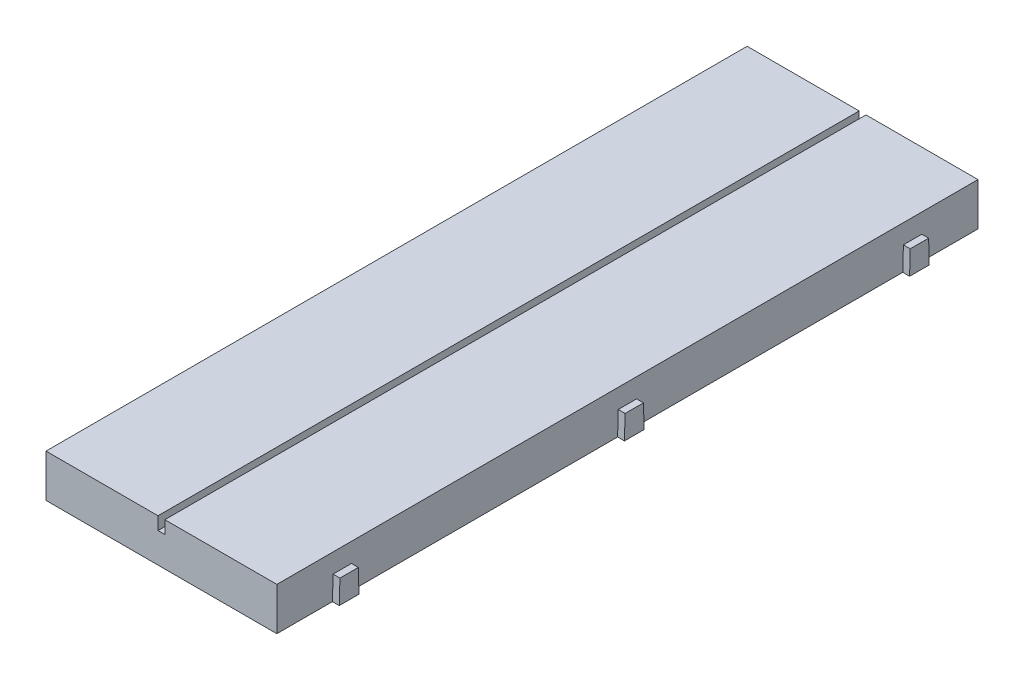
ISO-10303-21;
HEADER;
FILE_DESCRIPTION(('STEP AP214'),'2;1');
FILE_NAME('part.step','',(''),(''),'','','');
FILE_SCHEMA(('AUTOMOTIVE_DESIGN { 1 0 10303 214 1 1 1 1 }'));
ENDSEC;
DATA;
#1=APPLICATION_CONTEXT('core data for automotive mechanical design processes');
#2=APPLICATION_PROTOCOL_DEFINITION('international standard','automotive_design',2000,#1);
#3=PRODUCT_CONTEXT('',#1,'mechanical');
#4=PRODUCT('Part','Part','',(#3));
#5=PRODUCT_RELATED_PRODUCT_CATEGORY('part','',(#4));
#6=PRODUCT_DEFINITION_FORMATION('','',#4);
#7=PRODUCT_DEFINITION_CONTEXT('part definition',#1,'design');
#8=PRODUCT_DEFINITION('design','',#6,#7);
#9=PRODUCT_DEFINITION_SHAPE('','',#8);
#10=(LENGTH_UNIT() NAMED_UNIT(*) SI_UNIT(.MILLI.,.METRE.));
#11=(NAMED_UNIT(*) PLANE_ANGLE_UNIT() SI_UNIT($,.RADIAN.));
#12=(NAMED_UNIT(*) SI_UNIT($,.STERADIAN.) SOLID_ANGLE_UNIT());
#13=UNCERTAINTY_MEASURE_WITH_UNIT(LENGTH_MEASURE(1.E-05),#10,'distance_accuracy_value','');
#14=(GEOMETRIC_REPRESENTATION_CONTEXT(3) GLOBAL_UNCERTAINTY_ASSIGNED_CONTEXT((#13)) GLOBAL_UNIT_ASSIGNED_CONTEXT((#10,
#11,#12)) REPRESENTATION_CONTEXT('',''));
#15=CARTESIAN_POINT('',(0.,0.,0.));
#16=DIRECTION('',(0.,0.,1.));
#17=DIRECTION('',(1.,0.,0.));
#18=AXIS2_PLACEMENT_3D('',#15,#16,#17);
#19=CARTESIAN_POINT('',(27.,9.99999999999999,164.));
#20=DIRECTION('',(-1.,0.,0.));
#21=DIRECTION('',(0.,0.,1.));
#22=AXIS2_PLACEMENT_3D('',#19,#20,#21);
#23=PLANE('',#22);
#24=DIRECTION('',(0.,0.99962830651038,0.0272625901775528));
#25=VECTOR('',#24,1.);
#26=CARTESIAN_POINT('',(27.,5.5,79.85));
#27=LINE('',#26,#25);
#28=CARTESIAN_POINT('',(27.,0.,79.7));
#29=VERTEX_POINT('',#28);
#30=CARTESIAN_POINT('',(27.,5.5,79.85));
#31=VERTEX_POINT('',#30);
#32=EDGE_CURVE('E379',#29,#31,#27,.T.);
#33=ORIENTED_EDGE('',*,*,#32,.F.);
#34=DIRECTION('',(0.,0.,-1.));
#35=VECTOR('',#34,1.);
#36=CARTESIAN_POINT('',(27.,0.,164.));
#37=LINE('',#36,#35);
#38=CARTESIAN_POINT('',(27.,0.,17.6));
#39=VERTEX_POINT('',#38);
#40=EDGE_CURVE('E575',#29,#39,#37,.T.);
#41=ORIENTED_EDGE('',*,*,#40,.T.);
#42=DIRECTION('',(0.,-0.99962830651038,0.0272625901775527));
#43=VECTOR('',#42,1.);
#44=CARTESIAN_POINT('',(27.,5.50000000000002,17.45));
#45=LINE('',#44,#43);
#46=CARTESIAN_POINT('',(27.,5.50000000000002,17.45));
#47=VERTEX_POINT('',#46);
#48=EDGE_CURVE('E426',#47,#39,#45,.T.);
#49=ORIENTED_EDGE('',*,*,#48,.F.);
#50=DIRECTION('',(0.,0.,1.));
#51=VECTOR('',#50,1.);
#52=CARTESIAN_POINT('',(27.,5.50000000000002,13.15));
#53=LINE('',#52,#51);
#54=CARTESIAN_POINT('',(27.,5.50000000000002,13.15));
#55=VERTEX_POINT('',#54);
#56=EDGE_CURVE('E439',#55,#47,#53,.T.);
#57=ORIENTED_EDGE('',*,*,#56,.F.);
#58=DIRECTION('',(0.,0.99962830651038,0.0272625901775527));
#59=VECTOR('',#58,1.);
#60=CARTESIAN_POINT('',(27.,0.,13.));
#61=LINE('',#60,#59);
#62=CARTESIAN_POINT('',(27.,0.,13.));
#63=VERTEX_POINT('',#62);
#64=EDGE_CURVE('E420',#63,#55,#61,.T.);
#65=ORIENTED_EDGE('',*,*,#64,.F.);
#66=CARTESIAN_POINT('',(27.,0.,0.));
#67=VERTEX_POINT('',#66);
#68=EDGE_CURVE('E569',#63,#67,#37,.T.);
#69=ORIENTED_EDGE('',*,*,#68,.T.);
#70=DIRECTION('',(0.,1.,0.));
#71=VECTOR('',#70,1.);
#72=CARTESIAN_POINT('',(27.,9.99999999999999,0.));
#73=LINE('',#72,#71);
#74=CARTESIAN_POINT('',(27.,9.99999999999999,0.));
#75=VERTEX_POINT('',#74);
#76=EDGE_CURVE('E543',#67,#75,#73,.T.);
#77=ORIENTED_EDGE('',*,*,#76,.T.);
#78=DIRECTION('',(0.,0.,-1.));
#79=VECTOR('',#78,1.);
#80=CARTESIAN_POINT('',(27.,9.99999999999999,164.));
#81=LINE('',#80,#79);
#82=CARTESIAN_POINT('',(27.,9.99999999999999,164.));
#83=VERTEX_POINT('',#82);
#84=EDGE_CURVE('E565',#83,#75,#81,.T.);
#85=ORIENTED_EDGE('',*,*,#84,.F.);
#86=DIRECTION('',(0.,1.,0.));
#87=VECTOR('',#86,1.);
#88=CARTESIAN_POINT('',(27.,9.99999999999999,164.));
#89=LINE('',#88,#87);
#90=CARTESIAN_POINT('',(27.,0.,164.));
#91=VERTEX_POINT('',#90);
#92=EDGE_CURVE('E517',#91,#83,#89,.T.);
#93=ORIENTED_EDGE('',*,*,#92,.F.);
#94=CARTESIAN_POINT('',(27.,0.,151.));
#95=VERTEX_POINT('',#94);
#96=EDGE_CURVE('E570',#91,#95,#37,.T.);
#97=ORIENTED_EDGE('',*,*,#96,.T.);
#98=DIRECTION('',(0.,-0.99962830651038,0.0272625901775528));
#99=VECTOR('',#98,1.);
#100=CARTESIAN_POINT('',(27.,0.,151.));
#101=LINE('',#100,#99);
#102=CARTESIAN_POINT('',(27.,5.5,150.85));
#103=VERTEX_POINT('',#102);
#104=EDGE_CURVE('E467',#103,#95,#101,.T.);
#105=ORIENTED_EDGE('',*,*,#104,.F.);
#106=DIRECTION('',(0.,0.,1.));
#107=VECTOR('',#106,1.);
#108=CARTESIAN_POINT('',(27.,5.5,150.85));
#109=LINE('',#108,#107);
#110=CARTESIAN_POINT('',(27.,5.5,146.55));
#111=VERTEX_POINT('',#110);
#112=EDGE_CURVE('E480',#111,#103,#109,.T.);
#113=ORIENTED_EDGE('',*,*,#112,.F.);
#114=DIRECTION('',(0.,0.99962830651038,0.0272625901775528));
#115=VECTOR('',#114,1.);
#116=CARTESIAN_POINT('',(27.,5.5,146.55));
#117=LINE('',#116,#115);
#118=CARTESIAN_POINT('',(27.,0.,146.4));
#119=VERTEX_POINT('',#118);
#120=EDGE_CURVE('E461',#119,#111,#117,.T.);
#121=ORIENTED_EDGE('',*,*,#120,.F.);
#122=CARTESIAN_POINT('',(27.,0.,84.3));
#123=VERTEX_POINT('',#122);
#124=EDGE_CURVE('E574',#119,#123,#37,.T.);
#125=ORIENTED_EDGE('',*,*,#124,.T.);
#126=DIRECTION('',(0.,-0.99962830651038,0.0272625901775528));
#127=VECTOR('',#126,1.);
#128=CARTESIAN_POINT('',(27.,0.,84.3));
#129=LINE('',#128,#127);
#130=CARTESIAN_POINT('',(27.,5.5,84.15));
#131=VERTEX_POINT('',#130);
#132=EDGE_CURVE('E385',#131,#123,#129,.T.);
#133=ORIENTED_EDGE('',*,*,#132,.F.);
#134=DIRECTION('',(0.,0.,1.));
#135=VECTOR('',#134,1.);
#136=CARTESIAN_POINT('',(27.,5.5,84.15));
#137=LINE('',#136,#135);
#138=EDGE_CURVE('E398',#31,#131,#137,.T.);
#139=ORIENTED_EDGE('',*,*,#138,.F.);
#140=EDGE_LOOP('',(#33,#41,#49,#57,#65,#69,#77,#85,#93,#97,#105,#113,#121,#125,#133,#139));
#141=FACE_BOUND('',#140,.T.);
#142=ADVANCED_FACE('F39',(#141),#23,.F.);
#143=CARTESIAN_POINT('',(-0.799999999999999,9.99999999999999,164.));
#144=DIRECTION('',(-1.,0.,0.));
#145=DIRECTION('',(0.,-1.,0.));
#146=AXIS2_PLACEMENT_3D('',#143,#144,#145);
#147=PLANE('',#146);
#148=DIRECTION('',(0.,1.,0.));
#149=VECTOR('',#148,1.);
#150=CARTESIAN_POINT('',(-0.799999999999999,9.99999999999999,0.));
#151=LINE('',#150,#149);
#152=CARTESIAN_POINT('',(-0.8,7.,0.));
#153=VERTEX_POINT('',#152);
#154=CARTESIAN_POINT('',(-0.799999999999999,9.99999999999999,0.));
#155=VERTEX_POINT('',#154);
#156=EDGE_CURVE('E502',#153,#155,#151,.T.);
#157=ORIENTED_EDGE('',*,*,#156,.T.);
#158=DIRECTION('',(0.,0.,-1.));
#159=VECTOR('',#158,1.);
#160=CARTESIAN_POINT('',(-0.799999999999999,9.99999999999999,164.));
#161=LINE('',#160,#159);
#162=CARTESIAN_POINT('',(-0.799999999999999,9.99999999999999,164.));
#163=VERTEX_POINT('',#162);
#164=EDGE_CURVE('E11',#163,#155,#161,.T.);
#165=ORIENTED_EDGE('',*,*,#164,.F.);
#166=DIRECTION('',(0.,1.,0.));
#167=VECTOR('',#166,1.);
#168=CARTESIAN_POINT('',(-0.799999999999999,9.99999999999999,164.));
#169=LINE('',#168,#167);
#170=CARTESIAN_POINT('',(-0.8,7.,164.));
#171=VERTEX_POINT('',#170);
#172=EDGE_CURVE('E503',#171,#163,#169,.T.);
#173=ORIENTED_EDGE('',*,*,#172,.F.);
#174=DIRECTION('',(0.,0.,-1.));
#175=VECTOR('',#174,1.);
#176=CARTESIAN_POINT('',(-0.8,7.,164.));
#177=LINE('',#176,#175);
#178=EDGE_CURVE('E529',#171,#153,#177,.T.);
#179=ORIENTED_EDGE('',*,*,#178,.T.);
#180=EDGE_LOOP('',(#157,#165,#173,#179));
#181=FACE_BOUND('',#180,.T.);
#182=ADVANCED_FACE('F41',(#181),#147,.F.);
#183=CARTESIAN_POINT('',(-27.,9.99999999999999,164.));
#184=DIRECTION('',(0.,-1.,0.));
#185=DIRECTION('',(1.,0.,0.));
#186=AXIS2_PLACEMENT_3D('',#183,#184,#185);
#187=PLANE('',#186);
#188=DIRECTION('',(-1.,0.,0.));
#189=VECTOR('',#188,1.);
#190=CARTESIAN_POINT('',(-27.,9.99999999999999,0.));
#191=LINE('',#190,#189);
#192=CARTESIAN_POINT('',(-27.,9.99999999999999,0.));
#193=VERTEX_POINT('',#192);
#194=EDGE_CURVE('E533',#155,#193,#191,.T.);
#195=ORIENTED_EDGE('',*,*,#194,.T.);
#196=DIRECTION('',(0.,0.,-1.));
#197=VECTOR('',#196,1.);
#198=CARTESIAN_POINT('',(-27.,9.99999999999999,164.));
#199=LINE('',#198,#197);
#200=CARTESIAN_POINT('',(-27.,9.99999999999999,164.));
#201=VERTEX_POINT('',#200);
#202=EDGE_CURVE('E48',#201,#193,#199,.T.);
#203=ORIENTED_EDGE('',*,*,#202,.F.);
#204=DIRECTION('',(-1.,0.,0.));
#205=VECTOR('',#204,1.);
#206=CARTESIAN_POINT('',(-27.,9.99999999999999,164.));
#207=LINE('',#206,#205);
#208=EDGE_CURVE('E507',#163,#201,#207,.T.);
#209=ORIENTED_EDGE('',*,*,#208,.F.);
#210=ORIENTED_EDGE('',*,*,#164,.T.);
#211=EDGE_LOOP('',(#195,#203,#209,#210));
#212=FACE_BOUND('',#211,.T.);
#213=ADVANCED_FACE('F634',(#212),#187,.F.);
#214=CARTESIAN_POINT('',(-27.,9.99999999999999,164.));
#215=DIRECTION('',(1.,0.,0.));
#216=DIRECTION('',(0.,0.,-1.));
#217=AXIS2_PLACEMENT_3D('',#214,#215,#216);
#218=PLANE('',#217);
#219=DIRECTION('',(0.,0.,1.));
#220=VECTOR('',#219,1.);
#221=CARTESIAN_POINT('',(-27.,5.5,84.15));
#222=LINE('',#221,#220);
#223=CARTESIAN_POINT('',(-27.,5.5,79.85));
#224=VERTEX_POINT('',#223);
#225=CARTESIAN_POINT('',(-27.,5.5,84.15));
#226=VERTEX_POINT('',#225);
#227=EDGE_CURVE('E287',#224,#226,#222,.T.);
#228=ORIENTED_EDGE('',*,*,#227,.T.);
#229=DIRECTION('',(0.,-0.99962830651038,0.0272625901775528));
#230=VECTOR('',#229,1.);
#231=CARTESIAN_POINT('',(-27.,0.,84.3));
#232=LINE('',#231,#230);
#233=CARTESIAN_POINT('',(-27.,0.,84.3));
#234=VERTEX_POINT('',#233);
#235=EDGE_CURVE('E284',#226,#234,#232,.T.);
#236=ORIENTED_EDGE('',*,*,#235,.T.);
#237=DIRECTION('',(0.,0.,-1.));
#238=VECTOR('',#237,1.);
#239=CARTESIAN_POINT('',(-27.,0.,164.));
#240=LINE('',#239,#238);
#241=CARTESIAN_POINT('',(-27.,0.,146.4));
#242=VERTEX_POINT('',#241);
#243=EDGE_CURVE('E256',#242,#234,#240,.T.);
#244=ORIENTED_EDGE('',*,*,#243,.F.);
#245=DIRECTION('',(0.,0.99962830651038,0.0272625901775528));
#246=VECTOR('',#245,1.);
#247=CARTESIAN_POINT('',(-27.,5.5,146.55));
#248=LINE('',#247,#246);
#249=CARTESIAN_POINT('',(-27.,5.5,146.55));
#250=VERTEX_POINT('',#249);
#251=EDGE_CURVE('E345',#242,#250,#248,.T.);
#252=ORIENTED_EDGE('',*,*,#251,.T.);
#253=DIRECTION('',(0.,0.,1.));
#254=VECTOR('',#253,1.);
#255=CARTESIAN_POINT('',(-27.,5.5,150.85));
#256=LINE('',#255,#254);
#257=CARTESIAN_POINT('',(-27.,5.5,150.85));
#258=VERTEX_POINT('',#257);
#259=EDGE_CURVE('E361',#250,#258,#256,.T.);
#260=ORIENTED_EDGE('',*,*,#259,.T.);
#261=DIRECTION('',(0.,-0.99962830651038,0.0272625901775528));
#262=VECTOR('',#261,1.);
#263=CARTESIAN_POINT('',(-27.,0.,151.));
#264=LINE('',#263,#262);
#265=CARTESIAN_POINT('',(-27.,0.,151.));
#266=VERTEX_POINT('',#265);
#267=EDGE_CURVE('E339',#258,#266,#264,.T.);
#268=ORIENTED_EDGE('',*,*,#267,.T.);
#269=CARTESIAN_POINT('',(-27.,0.,164.));
#270=VERTEX_POINT('',#269);
#271=EDGE_CURVE('E576',#270,#266,#240,.T.);
#272=ORIENTED_EDGE('',*,*,#271,.F.);
#273=DIRECTION('',(0.,-1.,0.));
#274=VECTOR('',#273,1.);
#275=CARTESIAN_POINT('',(-27.,9.99999999999999,164.));
#276=LINE('',#275,#274);
#277=EDGE_CURVE('E511',#201,#270,#276,.T.);
#278=ORIENTED_EDGE('',*,*,#277,.F.);
#279=ORIENTED_EDGE('',*,*,#202,.T.);
#280=DIRECTION('',(0.,-1.,0.));
#281=VECTOR('',#280,1.);
#282=CARTESIAN_POINT('',(-27.,9.99999999999999,0.));
#283=LINE('',#282,#281);
#284=CARTESIAN_POINT('',(-27.,0.,0.));
#285=VERTEX_POINT('',#284);
#286=EDGE_CURVE('E536',#193,#285,#283,.T.);
#287=ORIENTED_EDGE('',*,*,#286,.T.);
#288=CARTESIAN_POINT('',(-27.,0.,13.));
#289=VERTEX_POINT('',#288);
#290=EDGE_CURVE('E573',#289,#285,#240,.T.);
#291=ORIENTED_EDGE('',*,*,#290,.F.);
#292=DIRECTION('',(0.,0.99962830651038,0.0272625901775527));
#293=VECTOR('',#292,1.);
#294=CARTESIAN_POINT('',(-27.,0.,13.));
#295=LINE('',#294,#293);
#296=CARTESIAN_POINT('',(-27.,5.50000000000002,13.15));
#297=VERTEX_POINT('',#296);
#298=EDGE_CURVE('E63',#289,#297,#295,.T.);
#299=ORIENTED_EDGE('',*,*,#298,.T.);
#300=DIRECTION('',(0.,0.,1.));
#301=VECTOR('',#300,1.);
#302=CARTESIAN_POINT('',(-27.,5.50000000000002,13.15));
#303=LINE('',#302,#301);
#304=CARTESIAN_POINT('',(-27.,5.50000000000002,17.45));
#305=VERTEX_POINT('',#304);
#306=EDGE_CURVE('E305',#297,#305,#303,.T.);
#307=ORIENTED_EDGE('',*,*,#306,.T.);
#308=DIRECTION('',(0.,-0.99962830651038,0.0272625901775527));
#309=VECTOR('',#308,1.);
#310=CARTESIAN_POINT('',(-27.,5.50000000000002,17.45));
#311=LINE('',#310,#309);
#312=CARTESIAN_POINT('',(-27.,0.,17.6));
#313=VERTEX_POINT('',#312);
#314=EDGE_CURVE('E320',#305,#313,#311,.T.);
#315=ORIENTED_EDGE('',*,*,#314,.T.);
#316=CARTESIAN_POINT('',(-27.,0.,79.7));
#317=VERTEX_POINT('',#316);
#318=EDGE_CURVE('E579',#317,#313,#240,.T.);
#319=ORIENTED_EDGE('',*,*,#318,.F.);
#320=DIRECTION('',(0.,0.99962830651038,0.0272625901775528));
#321=VECTOR('',#320,1.);
#322=CARTESIAN_POINT('',(-27.,5.5,79.85));
#323=LINE('',#322,#321);
#324=EDGE_CURVE('E55',#317,#224,#323,.T.);
#325=ORIENTED_EDGE('',*,*,#324,.T.);
#326=EDGE_LOOP('',(#228,#236,#244,#252,#260,#268,#272,#278,#279,#287,#291,#299,#307,#315,#319,#325));
#327=FACE_BOUND('',#326,.T.);
#328=ADVANCED_FACE('F586',(#327),#218,.F.);
#329=CARTESIAN_POINT('',(-27.,0.,164.));
#330=DIRECTION('',(0.,1.,0.));
#331=DIRECTION('',(-1.,0.,0.));
#332=AXIS2_PLACEMENT_3D('',#329,#330,#331);
#333=PLANE('',#332);
#334=DIRECTION('',(1.,0.,0.));
#335=VECTOR('',#334,1.);
#336=CARTESIAN_POINT('',(-27.,0.,0.));
#337=LINE('',#336,#335);
#338=EDGE_CURVE('E540',#285,#67,#337,.T.);
#339=ORIENTED_EDGE('',*,*,#338,.T.);
#340=ORIENTED_EDGE('',*,*,#68,.F.);
#341=DIRECTION('',(-1.,0.,0.));
#342=VECTOR('',#341,1.);
#343=CARTESIAN_POINT('',(28.6,0.,13.));
#344=LINE('',#343,#342);
#345=CARTESIAN_POINT('',(28.6,0.,13.));
#346=VERTEX_POINT('',#345);
#347=EDGE_CURVE('E435',#346,#63,#344,.T.);
#348=ORIENTED_EDGE('',*,*,#347,.F.);
#349=DIRECTION('',(0.,0.,-1.));
#350=VECTOR('',#349,1.);
#351=CARTESIAN_POINT('',(28.6,0.,13.));
#352=LINE('',#351,#350);
#353=CARTESIAN_POINT('',(28.6,0.,17.6));
#354=VERTEX_POINT('',#353);
#355=EDGE_CURVE('E432',#354,#346,#352,.T.);
#356=ORIENTED_EDGE('',*,*,#355,.F.);
#357=DIRECTION('',(-1.,0.,0.));
#358=VECTOR('',#357,1.);
#359=CARTESIAN_POINT('',(28.6,0.,17.6));
#360=LINE('',#359,#358);
#361=EDGE_CURVE('E449',#354,#39,#360,.T.);
#362=ORIENTED_EDGE('',*,*,#361,.T.);
#363=ORIENTED_EDGE('',*,*,#40,.F.);
#364=DIRECTION('',(-1.,0.,0.));
#365=VECTOR('',#364,1.);
#366=CARTESIAN_POINT('',(28.6,0.,79.7));
#367=LINE('',#366,#365);
#368=CARTESIAN_POINT('',(28.6,0.,79.7));
#369=VERTEX_POINT('',#368);
#370=EDGE_CURVE('E416',#369,#29,#367,.T.);
#371=ORIENTED_EDGE('',*,*,#370,.F.);
#372=DIRECTION('',(0.,0.,-1.));
#373=VECTOR('',#372,1.);
#374=CARTESIAN_POINT('',(28.6,0.,79.7));
#375=LINE('',#374,#373);
#376=CARTESIAN_POINT('',(28.6,0.,84.3));
#377=VERTEX_POINT('',#376);
#378=EDGE_CURVE('E380',#377,#369,#375,.T.);
#379=ORIENTED_EDGE('',*,*,#378,.F.);
#380=DIRECTION('',(-1.,0.,0.));
#381=VECTOR('',#380,1.);
#382=CARTESIAN_POINT('',(28.6,0.,84.3));
#383=LINE('',#382,#381);
#384=EDGE_CURVE('E394',#377,#123,#383,.T.);
#385=ORIENTED_EDGE('',*,*,#384,.T.);
#386=ORIENTED_EDGE('',*,*,#124,.F.);
#387=DIRECTION('',(-1.,0.,0.));
#388=VECTOR('',#387,1.);
#389=CARTESIAN_POINT('',(28.6,0.,146.4));
#390=LINE('',#389,#388);
#391=CARTESIAN_POINT('',(28.6,0.,146.4));
#392=VERTEX_POINT('',#391);
#393=EDGE_CURVE('E498',#392,#119,#390,.T.);
#394=ORIENTED_EDGE('',*,*,#393,.F.);
#395=DIRECTION('',(0.,0.,-1.));
#396=VECTOR('',#395,1.);
#397=CARTESIAN_POINT('',(28.6,0.,151.));
#398=LINE('',#397,#396);
#399=CARTESIAN_POINT('',(28.6,0.,151.));
#400=VERTEX_POINT('',#399);
#401=EDGE_CURVE('E462',#400,#392,#398,.T.);
#402=ORIENTED_EDGE('',*,*,#401,.F.);
#403=DIRECTION('',(-1.,0.,0.));
#404=VECTOR('',#403,1.);
#405=CARTESIAN_POINT('',(28.6,0.,151.));
#406=LINE('',#405,#404);
#407=EDGE_CURVE('E476',#400,#95,#406,.T.);
#408=ORIENTED_EDGE('',*,*,#407,.T.);
#409=ORIENTED_EDGE('',*,*,#96,.F.);
#410=DIRECTION('',(1.,0.,0.));
#411=VECTOR('',#410,1.);
#412=CARTESIAN_POINT('',(-27.,0.,164.));
#413=LINE('',#412,#411);
#414=EDGE_CURVE('E514',#270,#91,#413,.T.);
#415=ORIENTED_EDGE('',*,*,#414,.F.);
#416=ORIENTED_EDGE('',*,*,#271,.T.);
#417=DIRECTION('',(1.,0.,0.));
#418=VECTOR('',#417,1.);
#419=CARTESIAN_POINT('',(-28.6,0.,151.));
#420=LINE('',#419,#418);
#421=CARTESIAN_POINT('',(-28.6,0.,151.));
#422=VERTEX_POINT('',#421);
#423=EDGE_CURVE('E376',#422,#266,#420,.T.);
#424=ORIENTED_EDGE('',*,*,#423,.F.);
#425=DIRECTION('',(0.,0.,-1.));
#426=VECTOR('',#425,1.);
#427=CARTESIAN_POINT('',(-28.6,0.,151.));
#428=LINE('',#427,#426);
#429=CARTESIAN_POINT('',(-28.6,0.,146.4));
#430=VERTEX_POINT('',#429);
#431=EDGE_CURVE('E340',#422,#430,#428,.T.);
#432=ORIENTED_EDGE('',*,*,#431,.T.);
#433=DIRECTION('',(1.,0.,0.));
#434=VECTOR('',#433,1.);
#435=CARTESIAN_POINT('',(-28.6,0.,146.4));
#436=LINE('',#435,#434);
#437=EDGE_CURVE('E357',#430,#242,#436,.T.);
#438=ORIENTED_EDGE('',*,*,#437,.T.);
#439=ORIENTED_EDGE('',*,*,#243,.T.);
#440=DIRECTION('',(1.,0.,0.));
#441=VECTOR('',#440,1.);
#442=CARTESIAN_POINT('',(-28.6,0.,84.3));
#443=LINE('',#442,#441);
#444=CARTESIAN_POINT('',(-28.6,0.,84.3));
#445=VERTEX_POINT('',#444);
#446=EDGE_CURVE('E249',#445,#234,#443,.T.);
#447=ORIENTED_EDGE('',*,*,#446,.F.);
#448=DIRECTION('',(0.,0.,-1.));
#449=VECTOR('',#448,1.);
#450=CARTESIAN_POINT('',(-28.6,0.,79.7));
#451=LINE('',#450,#449);
#452=CARTESIAN_POINT('',(-28.6,0.,79.7));
#453=VERTEX_POINT('',#452);
#454=EDGE_CURVE('E253',#445,#453,#451,.T.);
#455=ORIENTED_EDGE('',*,*,#454,.T.);
#456=DIRECTION('',(1.,0.,0.));
#457=VECTOR('',#456,1.);
#458=CARTESIAN_POINT('',(-28.6,0.,79.7));
#459=LINE('',#458,#457);
#460=EDGE_CURVE('E283',#453,#317,#459,.T.);
#461=ORIENTED_EDGE('',*,*,#460,.T.);
#462=ORIENTED_EDGE('',*,*,#318,.T.);
#463=DIRECTION('',(1.,0.,0.));
#464=VECTOR('',#463,1.);
#465=CARTESIAN_POINT('',(-28.6,0.,17.6));
#466=LINE('',#465,#464);
#467=CARTESIAN_POINT('',(-28.6,0.,17.6));
#468=VERTEX_POINT('',#467);
#469=EDGE_CURVE('E332',#468,#313,#466,.T.);
#470=ORIENTED_EDGE('',*,*,#469,.F.);
#471=DIRECTION('',(0.,0.,-1.));
#472=VECTOR('',#471,1.);
#473=CARTESIAN_POINT('',(-28.6,0.,13.));
#474=LINE('',#473,#472);
#475=CARTESIAN_POINT('',(-28.6,0.,13.));
#476=VERTEX_POINT('',#475);
#477=EDGE_CURVE('E304',#468,#476,#474,.T.);
#478=ORIENTED_EDGE('',*,*,#477,.T.);
#479=DIRECTION('',(1.,0.,0.));
#480=VECTOR('',#479,1.);
#481=CARTESIAN_POINT('',(-28.6,0.,13.));
#482=LINE('',#481,#480);
#483=EDGE_CURVE('E336',#476,#289,#482,.T.);
#484=ORIENTED_EDGE('',*,*,#483,.T.);
#485=ORIENTED_EDGE('',*,*,#290,.T.);
#486=EDGE_LOOP('',(#339,#340,#348,#356,#362,#363,#371,#379,#385,#386,#394,#402,#408,#409,#415,
#416,#424,#432,#438,#439,#447,#455,#461,#462,#470,#478,#484,#485));
#487=FACE_BOUND('',#486,.T.);
#488=ADVANCED_FACE('F252',(#487),#333,.F.);
#489=CARTESIAN_POINT('',(0.799999999999999,9.99999999999999,164.));
#490=DIRECTION('',(0.,-1.,0.));
#491=DIRECTION('',(1.,0.,0.));
#492=AXIS2_PLACEMENT_3D('',#489,#490,#491);
#493=PLANE('',#492);
#494=DIRECTION('',(-1.,0.,0.));
#495=VECTOR('',#494,1.);
#496=CARTESIAN_POINT('',(0.799999999999999,9.99999999999999,0.));
#497=LINE('',#496,#495);
#498=CARTESIAN_POINT('',(0.799999999999999,9.99999999999999,0.));
#499=VERTEX_POINT('',#498);
#500=EDGE_CURVE('E546',#75,#499,#497,.T.);
#501=ORIENTED_EDGE('',*,*,#500,.T.);
#502=DIRECTION('',(0.,0.,-1.));
#503=VECTOR('',#502,1.);
#504=CARTESIAN_POINT('',(0.799999999999999,9.99999999999999,164.));
#505=LINE('',#504,#503);
#506=CARTESIAN_POINT('',(0.799999999999999,9.99999999999999,164.));
#507=VERTEX_POINT('',#506);
#508=EDGE_CURVE('E561',#507,#499,#505,.T.);
#509=ORIENTED_EDGE('',*,*,#508,.F.);
#510=DIRECTION('',(-1.,0.,0.));
#511=VECTOR('',#510,1.);
#512=CARTESIAN_POINT('',(0.799999999999999,9.99999999999999,164.));
#513=LINE('',#512,#511);
#514=EDGE_CURVE('E520',#83,#507,#513,.T.);
#515=ORIENTED_EDGE('',*,*,#514,.F.);
#516=ORIENTED_EDGE('',*,*,#84,.T.);
#517=EDGE_LOOP('',(#501,#509,#515,#516));
#518=FACE_BOUND('',#517,.T.);
#519=ADVANCED_FACE('F639',(#518),#493,.F.);
#520=CARTESIAN_POINT('',(0.799999999999999,9.99999999999999,164.));
#521=DIRECTION('',(1.,0.,0.));
#522=DIRECTION('',(0.,1.,0.));
#523=AXIS2_PLACEMENT_3D('',#520,#521,#522);
#524=PLANE('',#523);
#525=DIRECTION('',(0.,-1.,0.));
#526=VECTOR('',#525,1.);
#527=CARTESIAN_POINT('',(0.799999999999999,9.99999999999999,0.));
#528=LINE('',#527,#526);
#529=CARTESIAN_POINT('',(0.8,6.99999999999999,0.));
#530=VERTEX_POINT('',#529);
#531=EDGE_CURVE('E549',#499,#530,#528,.T.);
#532=ORIENTED_EDGE('',*,*,#531,.T.);
#533=DIRECTION('',(0.,0.,-1.));
#534=VECTOR('',#533,1.);
#535=CARTESIAN_POINT('',(0.8,6.99999999999999,164.));
#536=LINE('',#535,#534);
#537=CARTESIAN_POINT('',(0.8,6.99999999999999,164.));
#538=VERTEX_POINT('',#537);
#539=EDGE_CURVE('E557',#538,#530,#536,.T.);
#540=ORIENTED_EDGE('',*,*,#539,.F.);
#541=DIRECTION('',(0.,-1.,0.));
#542=VECTOR('',#541,1.);
#543=CARTESIAN_POINT('',(0.799999999999999,9.99999999999999,164.));
#544=LINE('',#543,#542);
#545=EDGE_CURVE('E523',#507,#538,#544,.T.);
#546=ORIENTED_EDGE('',*,*,#545,.F.);
#547=ORIENTED_EDGE('',*,*,#508,.T.);
#548=EDGE_LOOP('',(#532,#540,#546,#547));
#549=FACE_BOUND('',#548,.T.);
#550=ADVANCED_FACE('F659',(#549),#524,.F.);
#551=CARTESIAN_POINT('',(-0.8,7.,164.));
#552=DIRECTION('',(0.,-1.,0.));
#553=DIRECTION('',(1.,0.,0.));
#554=AXIS2_PLACEMENT_3D('',#551,#552,#553);
#555=PLANE('',#554);
#556=DIRECTION('',(-1.,0.,0.));
#557=VECTOR('',#556,1.);
#558=CARTESIAN_POINT('',(-0.8,7.,0.));
#559=LINE('',#558,#557);
#560=EDGE_CURVE('E508',#530,#153,#559,.T.);
#561=ORIENTED_EDGE('',*,*,#560,.T.);
#562=ORIENTED_EDGE('',*,*,#178,.F.);
#563=DIRECTION('',(-1.,0.,0.));
#564=VECTOR('',#563,1.);
#565=CARTESIAN_POINT('',(-0.8,7.,164.));
#566=LINE('',#565,#564);
#567=EDGE_CURVE('E526',#538,#171,#566,.T.);
#568=ORIENTED_EDGE('',*,*,#567,.F.);
#569=ORIENTED_EDGE('',*,*,#539,.T.);
#570=EDGE_LOOP('',(#561,#562,#568,#569));
#571=FACE_BOUND('',#570,.T.);
#572=ADVANCED_FACE('F654',(#571),#555,.F.);
#573=CARTESIAN_POINT('',(0.,0.,164.));
#574=DIRECTION('',(0.,0.,1.));
#575=DIRECTION('',(1.,0.,0.));
#576=AXIS2_PLACEMENT_3D('',#573,#574,#575);
#577=PLANE('',#576);
#578=ORIENTED_EDGE('',*,*,#172,.T.);
#579=ORIENTED_EDGE('',*,*,#208,.T.);
#580=ORIENTED_EDGE('',*,*,#277,.T.);
#581=ORIENTED_EDGE('',*,*,#414,.T.);
#582=ORIENTED_EDGE('',*,*,#92,.T.);
#583=ORIENTED_EDGE('',*,*,#514,.T.);
#584=ORIENTED_EDGE('',*,*,#545,.T.);
#585=ORIENTED_EDGE('',*,*,#567,.T.);
#586=EDGE_LOOP('',(#578,#579,#580,#581,#582,#583,#584,#585));
#587=FACE_BOUND('',#586,.T.);
#588=ADVANCED_FACE('F725',(#587),#577,.T.);
#589=CARTESIAN_POINT('',(0.,0.,0.));
#590=DIRECTION('',(0.,0.,1.));
#591=DIRECTION('',(1.,0.,0.));
#592=AXIS2_PLACEMENT_3D('',#589,#590,#591);
#593=PLANE('',#592);
#594=ORIENTED_EDGE('',*,*,#156,.F.);
#595=ORIENTED_EDGE('',*,*,#560,.F.);
#596=ORIENTED_EDGE('',*,*,#531,.F.);
#597=ORIENTED_EDGE('',*,*,#500,.F.);
#598=ORIENTED_EDGE('',*,*,#76,.F.);
#599=ORIENTED_EDGE('',*,*,#338,.F.);
#600=ORIENTED_EDGE('',*,*,#286,.F.);
#601=ORIENTED_EDGE('',*,*,#194,.F.);
#602=EDGE_LOOP('',(#594,#595,#596,#597,#598,#599,#600,#601));
#603=FACE_BOUND('',#602,.T.);
#604=ADVANCED_FACE('F593',(#603),#593,.F.);
#605=CARTESIAN_POINT('',(28.6,5.5,146.55));
#606=DIRECTION('',(0.,-0.0272625901775528,0.99962830651038));
#607=DIRECTION('',(0.,-0.99962830651038,-0.0272625901775528));
#608=AXIS2_PLACEMENT_3D('',#605,#606,#607);
#609=PLANE('',#608);
#610=ORIENTED_EDGE('',*,*,#120,.T.);
#611=DIRECTION('',(-1.,0.,0.));
#612=VECTOR('',#611,1.);
#613=CARTESIAN_POINT('',(28.6,5.5,146.55));
#614=LINE('',#613,#612);
#615=CARTESIAN_POINT('',(28.6,5.5,146.55));
#616=VERTEX_POINT('',#615);
#617=EDGE_CURVE('E494',#616,#111,#614,.T.);
#618=ORIENTED_EDGE('',*,*,#617,.F.);
#619=DIRECTION('',(0.,0.99962830651038,0.0272625901775528));
#620=VECTOR('',#619,1.);
#621=CARTESIAN_POINT('',(28.6,5.5,146.55));
#622=LINE('',#621,#620);
#623=EDGE_CURVE('E466',#392,#616,#622,.T.);
#624=ORIENTED_EDGE('',*,*,#623,.F.);
#625=ORIENTED_EDGE('',*,*,#393,.T.);
#626=EDGE_LOOP('',(#610,#618,#624,#625));
#627=FACE_BOUND('',#626,.T.);
#628=ADVANCED_FACE('F720',(#627),#609,.F.);
#629=CARTESIAN_POINT('',(28.6,5.5,150.85));
#630=DIRECTION('',(0.,-1.,0.));
#631=DIRECTION('',(0.,0.,-1.));
#632=AXIS2_PLACEMENT_3D('',#629,#630,#631);
#633=PLANE('',#632);
#634=ORIENTED_EDGE('',*,*,#112,.T.);
#635=DIRECTION('',(-1.,0.,0.));
#636=VECTOR('',#635,1.);
#637=CARTESIAN_POINT('',(28.6,5.5,150.85));
#638=LINE('',#637,#636);
#639=CARTESIAN_POINT('',(28.6,5.5,150.85));
#640=VERTEX_POINT('',#639);
#641=EDGE_CURVE('E490',#640,#103,#638,.T.);
#642=ORIENTED_EDGE('',*,*,#641,.F.);
#643=DIRECTION('',(0.,0.,1.));
#644=VECTOR('',#643,1.);
#645=CARTESIAN_POINT('',(28.6,5.5,150.85));
#646=LINE('',#645,#644);
#647=EDGE_CURVE('E470',#616,#640,#646,.T.);
#648=ORIENTED_EDGE('',*,*,#647,.F.);
#649=ORIENTED_EDGE('',*,*,#617,.T.);
#650=EDGE_LOOP('',(#634,#642,#648,#649));
#651=FACE_BOUND('',#650,.T.);
#652=ADVANCED_FACE('F716',(#651),#633,.F.);
#653=CARTESIAN_POINT('',(28.6,0.,151.));
#654=DIRECTION('',(0.,-0.0272625901775528,-0.99962830651038));
#655=DIRECTION('',(0.,0.99962830651038,-0.0272625901775528));
#656=AXIS2_PLACEMENT_3D('',#653,#654,#655);
#657=PLANE('',#656);
#658=ORIENTED_EDGE('',*,*,#104,.T.);
#659=ORIENTED_EDGE('',*,*,#407,.F.);
#660=DIRECTION('',(0.,-0.99962830651038,0.0272625901775528));
#661=VECTOR('',#660,1.);
#662=CARTESIAN_POINT('',(28.6,0.,151.));
#663=LINE('',#662,#661);
#664=EDGE_CURVE('E473',#640,#400,#663,.T.);
#665=ORIENTED_EDGE('',*,*,#664,.F.);
#666=ORIENTED_EDGE('',*,*,#641,.T.);
#667=EDGE_LOOP('',(#658,#659,#665,#666));
#668=FACE_BOUND('',#667,.T.);
#669=ADVANCED_FACE('F712',(#668),#657,.F.);
#670=CARTESIAN_POINT('',(28.6,0.,0.));
#671=DIRECTION('',(-1.,0.,0.));
#672=DIRECTION('',(0.,0.,1.));
#673=AXIS2_PLACEMENT_3D('',#670,#671,#672);
#674=PLANE('',#673);
#675=ORIENTED_EDGE('',*,*,#401,.T.);
#676=ORIENTED_EDGE('',*,*,#623,.T.);
#677=ORIENTED_EDGE('',*,*,#647,.T.);
#678=ORIENTED_EDGE('',*,*,#664,.T.);
#679=EDGE_LOOP('',(#675,#676,#677,#678));
#680=FACE_BOUND('',#679,.T.);
#681=ADVANCED_FACE('F708',(#680),#674,.F.);
#682=CARTESIAN_POINT('',(28.6,0.,13.));
#683=DIRECTION('',(0.,-0.0272625901775527,0.99962830651038));
#684=DIRECTION('',(0.,-0.99962830651038,-0.0272625901775527));
#685=AXIS2_PLACEMENT_3D('',#682,#683,#684);
#686=PLANE('',#685);
#687=ORIENTED_EDGE('',*,*,#64,.T.);
#688=DIRECTION('',(-1.,0.,0.));
#689=VECTOR('',#688,1.);
#690=CARTESIAN_POINT('',(28.6,5.50000000000002,13.15));
#691=LINE('',#690,#689);
#692=CARTESIAN_POINT('',(28.6,5.50000000000002,13.15));
#693=VERTEX_POINT('',#692);
#694=EDGE_CURVE('E457',#693,#55,#691,.T.);
#695=ORIENTED_EDGE('',*,*,#694,.F.);
#696=DIRECTION('',(0.,0.99962830651038,0.0272625901775527));
#697=VECTOR('',#696,1.);
#698=CARTESIAN_POINT('',(28.6,0.,13.));
#699=LINE('',#698,#697);
#700=EDGE_CURVE('E421',#346,#693,#699,.T.);
#701=ORIENTED_EDGE('',*,*,#700,.F.);
#702=ORIENTED_EDGE('',*,*,#347,.T.);
#703=EDGE_LOOP('',(#687,#695,#701,#702));
#704=FACE_BOUND('',#703,.T.);
#705=ADVANCED_FACE('F704',(#704),#686,.F.);
#706=CARTESIAN_POINT('',(28.6,5.50000000000002,13.15));
#707=DIRECTION('',(0.,-1.,0.));
#708=DIRECTION('',(0.,0.,-1.));
#709=AXIS2_PLACEMENT_3D('',#706,#707,#708);
#710=PLANE('',#709);
#711=ORIENTED_EDGE('',*,*,#56,.T.);
#712=DIRECTION('',(-1.,0.,0.));
#713=VECTOR('',#712,1.);
#714=CARTESIAN_POINT('',(28.6,5.50000000000002,17.45));
#715=LINE('',#714,#713);
#716=CARTESIAN_POINT('',(28.6,5.50000000000002,17.45));
#717=VERTEX_POINT('',#716);
#718=EDGE_CURVE('E453',#717,#47,#715,.T.);
#719=ORIENTED_EDGE('',*,*,#718,.F.);
#720=DIRECTION('',(0.,0.,1.));
#721=VECTOR('',#720,1.);
#722=CARTESIAN_POINT('',(28.6,5.50000000000002,13.15));
#723=LINE('',#722,#721);
#724=EDGE_CURVE('E425',#693,#717,#723,.T.);
#725=ORIENTED_EDGE('',*,*,#724,.F.);
#726=ORIENTED_EDGE('',*,*,#694,.T.);
#727=EDGE_LOOP('',(#711,#719,#725,#726));
#728=FACE_BOUND('',#727,.T.);
#729=ADVANCED_FACE('F700',(#728),#710,.F.);
#730=CARTESIAN_POINT('',(28.6,5.50000000000002,17.45));
#731=DIRECTION('',(0.,-0.0272625901775527,-0.99962830651038));
#732=DIRECTION('',(0.,0.99962830651038,-0.0272625901775527));
#733=AXIS2_PLACEMENT_3D('',#730,#731,#732);
#734=PLANE('',#733);
#735=ORIENTED_EDGE('',*,*,#48,.T.);
#736=ORIENTED_EDGE('',*,*,#361,.F.);
#737=DIRECTION('',(0.,-0.99962830651038,0.0272625901775527));
#738=VECTOR('',#737,1.);
#739=CARTESIAN_POINT('',(28.6,5.50000000000002,17.45));
#740=LINE('',#739,#738);
#741=EDGE_CURVE('E429',#717,#354,#740,.T.);
#742=ORIENTED_EDGE('',*,*,#741,.F.);
#743=ORIENTED_EDGE('',*,*,#718,.T.);
#744=EDGE_LOOP('',(#735,#736,#742,#743));
#745=FACE_BOUND('',#744,.T.);
#746=ADVANCED_FACE('F693',(#745),#734,.F.);
#747=CARTESIAN_POINT('',(28.6,0.,0.));
#748=DIRECTION('',(1.,0.,0.));
#749=DIRECTION('',(0.,0.,-1.));
#750=AXIS2_PLACEMENT_3D('',#747,#748,#749);
#751=PLANE('',#750);
#752=ORIENTED_EDGE('',*,*,#700,.T.);
#753=ORIENTED_EDGE('',*,*,#724,.T.);
#754=ORIENTED_EDGE('',*,*,#741,.T.);
#755=ORIENTED_EDGE('',*,*,#355,.T.);
#756=EDGE_LOOP('',(#752,#753,#754,#755));
#757=FACE_BOUND('',#756,.T.);
#758=ADVANCED_FACE('F686',(#757),#751,.T.);
#759=CARTESIAN_POINT('',(28.6,5.5,79.85));
#760=DIRECTION('',(0.,-0.0272625901775528,0.99962830651038));
#761=DIRECTION('',(0.,-0.99962830651038,-0.0272625901775528));
#762=AXIS2_PLACEMENT_3D('',#759,#760,#761);
#763=PLANE('',#762);
#764=ORIENTED_EDGE('',*,*,#32,.T.);
#765=DIRECTION('',(-1.,0.,0.));
#766=VECTOR('',#765,1.);
#767=CARTESIAN_POINT('',(28.6,5.5,79.85));
#768=LINE('',#767,#766);
#769=CARTESIAN_POINT('',(28.6,5.5,79.85));
#770=VERTEX_POINT('',#769);
#771=EDGE_CURVE('E412',#770,#31,#768,.T.);
#772=ORIENTED_EDGE('',*,*,#771,.F.);
#773=DIRECTION('',(0.,0.99962830651038,0.0272625901775528));
#774=VECTOR('',#773,1.);
#775=CARTESIAN_POINT('',(28.6,5.5,79.85));
#776=LINE('',#775,#774);
#777=EDGE_CURVE('E384',#369,#770,#776,.T.);
#778=ORIENTED_EDGE('',*,*,#777,.F.);
#779=ORIENTED_EDGE('',*,*,#370,.T.);
#780=EDGE_LOOP('',(#764,#772,#778,#779));
#781=FACE_BOUND('',#780,.T.);
#782=ADVANCED_FACE('F684',(#781),#763,.F.);
#783=CARTESIAN_POINT('',(28.6,5.5,84.15));
#784=DIRECTION('',(0.,-1.,0.));
#785=DIRECTION('',(0.,0.,-1.));
#786=AXIS2_PLACEMENT_3D('',#783,#784,#785);
#787=PLANE('',#786);
#788=ORIENTED_EDGE('',*,*,#138,.T.);
#789=DIRECTION('',(-1.,0.,0.));
#790=VECTOR('',#789,1.);
#791=CARTESIAN_POINT('',(28.6,5.5,84.15));
#792=LINE('',#791,#790);
#793=CARTESIAN_POINT('',(28.6,5.5,84.15));
#794=VERTEX_POINT('',#793);
#795=EDGE_CURVE('E408',#794,#131,#792,.T.);
#796=ORIENTED_EDGE('',*,*,#795,.F.);
#797=DIRECTION('',(0.,0.,1.));
#798=VECTOR('',#797,1.);
#799=CARTESIAN_POINT('',(28.6,5.5,84.15));
#800=LINE('',#799,#798);
#801=EDGE_CURVE('E388',#770,#794,#800,.T.);
#802=ORIENTED_EDGE('',*,*,#801,.F.);
#803=ORIENTED_EDGE('',*,*,#771,.T.);
#804=EDGE_LOOP('',(#788,#796,#802,#803));
#805=FACE_BOUND('',#804,.T.);
#806=ADVANCED_FACE('F682',(#805),#787,.F.);
#807=CARTESIAN_POINT('',(28.6,0.,84.3));
#808=DIRECTION('',(0.,-0.0272625901775528,-0.99962830651038));
#809=DIRECTION('',(0.,0.99962830651038,-0.0272625901775528));
#810=AXIS2_PLACEMENT_3D('',#807,#808,#809);
#811=PLANE('',#810);
#812=ORIENTED_EDGE('',*,*,#132,.T.);
#813=ORIENTED_EDGE('',*,*,#384,.F.);
#814=DIRECTION('',(0.,-0.99962830651038,0.0272625901775528));
#815=VECTOR('',#814,1.);
#816=CARTESIAN_POINT('',(28.6,0.,84.3));
#817=LINE('',#816,#815);
#818=EDGE_CURVE('E391',#794,#377,#817,.T.);
#819=ORIENTED_EDGE('',*,*,#818,.F.);
#820=ORIENTED_EDGE('',*,*,#795,.T.);
#821=EDGE_LOOP('',(#812,#813,#819,#820));
#822=FACE_BOUND('',#821,.T.);
#823=ADVANCED_FACE('F672',(#822),#811,.F.);
#824=CARTESIAN_POINT('',(28.6,0.,0.));
#825=DIRECTION('',(-1.,0.,0.));
#826=DIRECTION('',(0.,0.,1.));
#827=AXIS2_PLACEMENT_3D('',#824,#825,#826);
#828=PLANE('',#827);
#829=ORIENTED_EDGE('',*,*,#378,.T.);
#830=ORIENTED_EDGE('',*,*,#777,.T.);
#831=ORIENTED_EDGE('',*,*,#801,.T.);
#832=ORIENTED_EDGE('',*,*,#818,.T.);
#833=EDGE_LOOP('',(#829,#830,#831,#832));
#834=FACE_BOUND('',#833,.T.);
#835=ADVANCED_FACE('F678',(#834),#828,.F.);
#836=CARTESIAN_POINT('',(-28.6,0.,151.));
#837=DIRECTION('',(0.,0.0272625901775528,0.99962830651038));
#838=DIRECTION('',(0.,-0.99962830651038,0.0272625901775528));
#839=AXIS2_PLACEMENT_3D('',#836,#837,#838);
#840=PLANE('',#839);
#841=ORIENTED_EDGE('',*,*,#267,.F.);
#842=DIRECTION('',(1.,0.,0.));
#843=VECTOR('',#842,1.);
#844=CARTESIAN_POINT('',(-28.6,5.5,150.85));
#845=LINE('',#844,#843);
#846=CARTESIAN_POINT('',(-28.6,5.5,150.85));
#847=VERTEX_POINT('',#846);
#848=EDGE_CURVE('E373',#847,#258,#845,.T.);
#849=ORIENTED_EDGE('',*,*,#848,.F.);
#850=DIRECTION('',(0.,-0.99962830651038,0.0272625901775528));
#851=VECTOR('',#850,1.);
#852=CARTESIAN_POINT('',(-28.6,0.,151.));
#853=LINE('',#852,#851);
#854=EDGE_CURVE('E344',#847,#422,#853,.T.);
#855=ORIENTED_EDGE('',*,*,#854,.T.);
#856=ORIENTED_EDGE('',*,*,#423,.T.);
#857=EDGE_LOOP('',(#841,#849,#855,#856));
#858=FACE_BOUND('',#857,.T.);
#859=ADVANCED_FACE('F762',(#858),#840,.T.);
#860=CARTESIAN_POINT('',(-28.6,5.5,150.85));
#861=DIRECTION('',(0.,1.,0.));
#862=DIRECTION('',(0.,0.,1.));
#863=AXIS2_PLACEMENT_3D('',#860,#861,#862);
#864=PLANE('',#863);
#865=ORIENTED_EDGE('',*,*,#259,.F.);
#866=DIRECTION('',(1.,0.,0.));
#867=VECTOR('',#866,1.);
#868=CARTESIAN_POINT('',(-28.6,5.5,146.55));
#869=LINE('',#868,#867);
#870=CARTESIAN_POINT('',(-28.6,5.5,146.55));
#871=VERTEX_POINT('',#870);
#872=EDGE_CURVE('E370',#871,#250,#869,.T.);
#873=ORIENTED_EDGE('',*,*,#872,.F.);
#874=DIRECTION('',(0.,0.,1.));
#875=VECTOR('',#874,1.);
#876=CARTESIAN_POINT('',(-28.6,5.5,150.85));
#877=LINE('',#876,#875);
#878=EDGE_CURVE('E349',#871,#847,#877,.T.);
#879=ORIENTED_EDGE('',*,*,#878,.T.);
#880=ORIENTED_EDGE('',*,*,#848,.T.);
#881=EDGE_LOOP('',(#865,#873,#879,#880));
#882=FACE_BOUND('',#881,.T.);
#883=ADVANCED_FACE('F766',(#882),#864,.T.);
#884=CARTESIAN_POINT('',(-28.6,5.5,146.55));
#885=DIRECTION('',(0.,0.0272625901775528,-0.99962830651038));
#886=DIRECTION('',(0.,0.99962830651038,0.0272625901775528));
#887=AXIS2_PLACEMENT_3D('',#884,#885,#886);
#888=PLANE('',#887);
#889=ORIENTED_EDGE('',*,*,#251,.F.);
#890=ORIENTED_EDGE('',*,*,#437,.F.);
#891=DIRECTION('',(0.,0.99962830651038,0.0272625901775528));
#892=VECTOR('',#891,1.);
#893=CARTESIAN_POINT('',(-28.6,5.5,146.55));
#894=LINE('',#893,#892);
#895=EDGE_CURVE('E353',#430,#871,#894,.T.);
#896=ORIENTED_EDGE('',*,*,#895,.T.);
#897=ORIENTED_EDGE('',*,*,#872,.T.);
#898=EDGE_LOOP('',(#889,#890,#896,#897));
#899=FACE_BOUND('',#898,.T.);
#900=ADVANCED_FACE('F623',(#899),#888,.T.);
#901=CARTESIAN_POINT('',(-28.6,0.,0.));
#902=DIRECTION('',(1.,0.,0.));
#903=DIRECTION('',(0.,0.,1.));
#904=AXIS2_PLACEMENT_3D('',#901,#902,#903);
#905=PLANE('',#904);
#906=ORIENTED_EDGE('',*,*,#431,.F.);
#907=ORIENTED_EDGE('',*,*,#854,.F.);
#908=ORIENTED_EDGE('',*,*,#878,.F.);
#909=ORIENTED_EDGE('',*,*,#895,.F.);
#910=EDGE_LOOP('',(#906,#907,#908,#909));
#911=FACE_BOUND('',#910,.T.);
#912=ADVANCED_FACE('F616',(#911),#905,.F.);
#913=CARTESIAN_POINT('',(-28.6,0.,13.));
#914=DIRECTION('',(0.,0.0272625901775527,-0.99962830651038));
#915=DIRECTION('',(0.,0.99962830651038,0.0272625901775527));
#916=AXIS2_PLACEMENT_3D('',#913,#914,#915);
#917=PLANE('',#916);
#918=ORIENTED_EDGE('',*,*,#298,.F.);
#919=ORIENTED_EDGE('',*,*,#483,.F.);
#920=DIRECTION('',(0.,0.99962830651038,0.0272625901775527));
#921=VECTOR('',#920,1.);
#922=CARTESIAN_POINT('',(-28.6,0.,13.));
#923=LINE('',#922,#921);
#924=CARTESIAN_POINT('',(-28.6,5.50000000000002,13.15));
#925=VERTEX_POINT('',#924);
#926=EDGE_CURVE('E300',#476,#925,#923,.T.);
#927=ORIENTED_EDGE('',*,*,#926,.T.);
#928=DIRECTION('',(1.,0.,0.));
#929=VECTOR('',#928,1.);
#930=CARTESIAN_POINT('',(-28.6,5.50000000000002,13.15));
#931=LINE('',#930,#929);
#932=EDGE_CURVE('E317',#925,#297,#931,.T.);
#933=ORIENTED_EDGE('',*,*,#932,.T.);
#934=EDGE_LOOP('',(#918,#919,#927,#933));
#935=FACE_BOUND('',#934,.T.);
#936=ADVANCED_FACE('F614',(#935),#917,.T.);
#937=CARTESIAN_POINT('',(-28.6,5.50000000000002,17.45));
#938=DIRECTION('',(0.,0.0272625901775527,0.99962830651038));
#939=DIRECTION('',(0.,-0.99962830651038,0.0272625901775527));
#940=AXIS2_PLACEMENT_3D('',#937,#938,#939);
#941=PLANE('',#940);
#942=ORIENTED_EDGE('',*,*,#314,.F.);
#943=DIRECTION('',(1.,0.,0.));
#944=VECTOR('',#943,1.);
#945=CARTESIAN_POINT('',(-28.6,5.50000000000002,17.45));
#946=LINE('',#945,#944);
#947=CARTESIAN_POINT('',(-28.6,5.50000000000002,17.45));
#948=VERTEX_POINT('',#947);
#949=EDGE_CURVE('E329',#948,#305,#946,.T.);
#950=ORIENTED_EDGE('',*,*,#949,.F.);
#951=DIRECTION('',(0.,-0.99962830651038,0.0272625901775527));
#952=VECTOR('',#951,1.);
#953=CARTESIAN_POINT('',(-28.6,5.50000000000002,17.45));
#954=LINE('',#953,#952);
#955=EDGE_CURVE('E309',#948,#468,#954,.T.);
#956=ORIENTED_EDGE('',*,*,#955,.T.);
#957=ORIENTED_EDGE('',*,*,#469,.T.);
#958=EDGE_LOOP('',(#942,#950,#956,#957));
#959=FACE_BOUND('',#958,.T.);
#960=ADVANCED_FACE('F605',(#959),#941,.T.);
#961=CARTESIAN_POINT('',(-28.6,5.50000000000002,13.15));
#962=DIRECTION('',(0.,1.,0.));
#963=DIRECTION('',(0.,0.,1.));
#964=AXIS2_PLACEMENT_3D('',#961,#962,#963);
#965=PLANE('',#964);
#966=ORIENTED_EDGE('',*,*,#306,.F.);
#967=ORIENTED_EDGE('',*,*,#932,.F.);
#968=DIRECTION('',(0.,0.,1.));
#969=VECTOR('',#968,1.);
#970=CARTESIAN_POINT('',(-28.6,5.50000000000002,13.15));
#971=LINE('',#970,#969);
#972=EDGE_CURVE('E313',#925,#948,#971,.T.);
#973=ORIENTED_EDGE('',*,*,#972,.T.);
#974=ORIENTED_EDGE('',*,*,#949,.T.);
#975=EDGE_LOOP('',(#966,#967,#973,#974));
#976=FACE_BOUND('',#975,.T.);
#977=ADVANCED_FACE('F609',(#976),#965,.T.);
#978=CARTESIAN_POINT('',(-28.6,0.,0.));
#979=DIRECTION('',(-1.,0.,0.));
#980=DIRECTION('',(0.,0.,-1.));
#981=AXIS2_PLACEMENT_3D('',#978,#979,#980);
#982=PLANE('',#981);
#983=ORIENTED_EDGE('',*,*,#926,.F.);
#984=ORIENTED_EDGE('',*,*,#477,.F.);
#985=ORIENTED_EDGE('',*,*,#955,.F.);
#986=ORIENTED_EDGE('',*,*,#972,.F.);
#987=EDGE_LOOP('',(#983,#984,#985,#986));
#988=FACE_BOUND('',#987,.T.);
#989=ADVANCED_FACE('F613',(#988),#982,.T.);
#990=CARTESIAN_POINT('',(-28.6,0.,84.3));
#991=DIRECTION('',(0.,0.0272625901775528,0.99962830651038));
#992=DIRECTION('',(0.,-0.99962830651038,0.0272625901775528));
#993=AXIS2_PLACEMENT_3D('',#990,#991,#992);
#994=PLANE('',#993);
#995=ORIENTED_EDGE('',*,*,#235,.F.);
#996=DIRECTION('',(1.,0.,0.));
#997=VECTOR('',#996,1.);
#998=CARTESIAN_POINT('',(-28.6,5.5,84.15));
#999=LINE('',#998,#997);
#1000=CARTESIAN_POINT('',(-28.6,5.5,84.15));
#1001=VERTEX_POINT('',#1000);
#1002=EDGE_CURVE('E262',#1001,#226,#999,.T.);
#1003=ORIENTED_EDGE('',*,*,#1002,.F.);
#1004=DIRECTION('',(0.,-0.99962830651038,0.0272625901775528));
#1005=VECTOR('',#1004,1.);
#1006=CARTESIAN_POINT('',(-28.6,0.,84.3));
#1007=LINE('',#1006,#1005);
#1008=EDGE_CURVE('E268',#1001,#445,#1007,.T.);
#1009=ORIENTED_EDGE('',*,*,#1008,.T.);
#1010=ORIENTED_EDGE('',*,*,#446,.T.);
#1011=EDGE_LOOP('',(#995,#1003,#1009,#1010));
#1012=FACE_BOUND('',#1011,.T.);
#1013=ADVANCED_FACE('F274',(#1012),#994,.T.);
#1014=CARTESIAN_POINT('',(-28.6,5.5,84.15));
#1015=DIRECTION('',(0.,1.,0.));
#1016=DIRECTION('',(0.,0.,1.));
#1017=AXIS2_PLACEMENT_3D('',#1014,#1015,#1016);
#1018=PLANE('',#1017);
#1019=ORIENTED_EDGE('',*,*,#227,.F.);
#1020=DIRECTION('',(1.,0.,0.));
#1021=VECTOR('',#1020,1.);
#1022=CARTESIAN_POINT('',(-28.6,5.5,79.85));
#1023=LINE('',#1022,#1021);
#1024=CARTESIAN_POINT('',(-28.6,5.5,79.85));
#1025=VERTEX_POINT('',#1024);
#1026=EDGE_CURVE('E295',#1025,#224,#1023,.T.);
#1027=ORIENTED_EDGE('',*,*,#1026,.F.);
#1028=DIRECTION('',(0.,0.,1.));
#1029=VECTOR('',#1028,1.);
#1030=CARTESIAN_POINT('',(-28.6,5.5,84.15));
#1031=LINE('',#1030,#1029);
#1032=EDGE_CURVE('E276',#1025,#1001,#1031,.T.);
#1033=ORIENTED_EDGE('',*,*,#1032,.T.);
#1034=ORIENTED_EDGE('',*,*,#1002,.T.);
#1035=EDGE_LOOP('',(#1019,#1027,#1033,#1034));
#1036=FACE_BOUND('',#1035,.T.);
#1037=ADVANCED_FACE('F826',(#1036),#1018,.T.);
#1038=CARTESIAN_POINT('',(-28.6,5.5,79.85));
#1039=DIRECTION('',(0.,0.0272625901775528,-0.99962830651038));
#1040=DIRECTION('',(0.,0.99962830651038,0.0272625901775528));
#1041=AXIS2_PLACEMENT_3D('',#1038,#1039,#1040);
#1042=PLANE('',#1041);
#1043=ORIENTED_EDGE('',*,*,#324,.F.);
#1044=ORIENTED_EDGE('',*,*,#460,.F.);
#1045=DIRECTION('',(0.,0.99962830651038,0.0272625901775528));
#1046=VECTOR('',#1045,1.);
#1047=CARTESIAN_POINT('',(-28.6,5.5,79.85));
#1048=LINE('',#1047,#1046);
#1049=EDGE_CURVE('E271',#453,#1025,#1048,.T.);
#1050=ORIENTED_EDGE('',*,*,#1049,.T.);
#1051=ORIENTED_EDGE('',*,*,#1026,.T.);
#1052=EDGE_LOOP('',(#1043,#1044,#1050,#1051));
#1053=FACE_BOUND('',#1052,.T.);
#1054=ADVANCED_FACE('F835',(#1053),#1042,.T.);
#1055=CARTESIAN_POINT('',(-28.6,0.,0.));
#1056=DIRECTION('',(1.,0.,0.));
#1057=DIRECTION('',(0.,0.,1.));
#1058=AXIS2_PLACEMENT_3D('',#1055,#1056,#1057);
#1059=PLANE('',#1058);
#1060=ORIENTED_EDGE('',*,*,#454,.F.);
#1061=ORIENTED_EDGE('',*,*,#1008,.F.);
#1062=ORIENTED_EDGE('',*,*,#1032,.F.);
#1063=ORIENTED_EDGE('',*,*,#1049,.F.);
#1064=EDGE_LOOP('',(#1060,#1061,#1062,#1063));
#1065=FACE_BOUND('',#1064,.T.);
#1066=ADVANCED_FACE('F266',(#1065),#1059,.F.);
#1067=CLOSED_SHELL('',(#142,#182,#213,#328,#488,#519,#550,#572,#588,#604,#628,#652,#669,#681,
#705,#729,#746,#758,#782,#806,#823,#835,#859,#883,#900,#912,#936,#960,#977,#989,#1013,#1037,
#1054,#1066));
#1068=MANIFOLD_SOLID_BREP('B2',#1067);
#1069=ADVANCED_BREP_SHAPE_REPRESENTATION('',(#18,#1068),#14);
#1070=SHAPE_DEFINITION_REPRESENTATION(#9,#1069);
ENDSEC;
END-ISO-10303-21;
